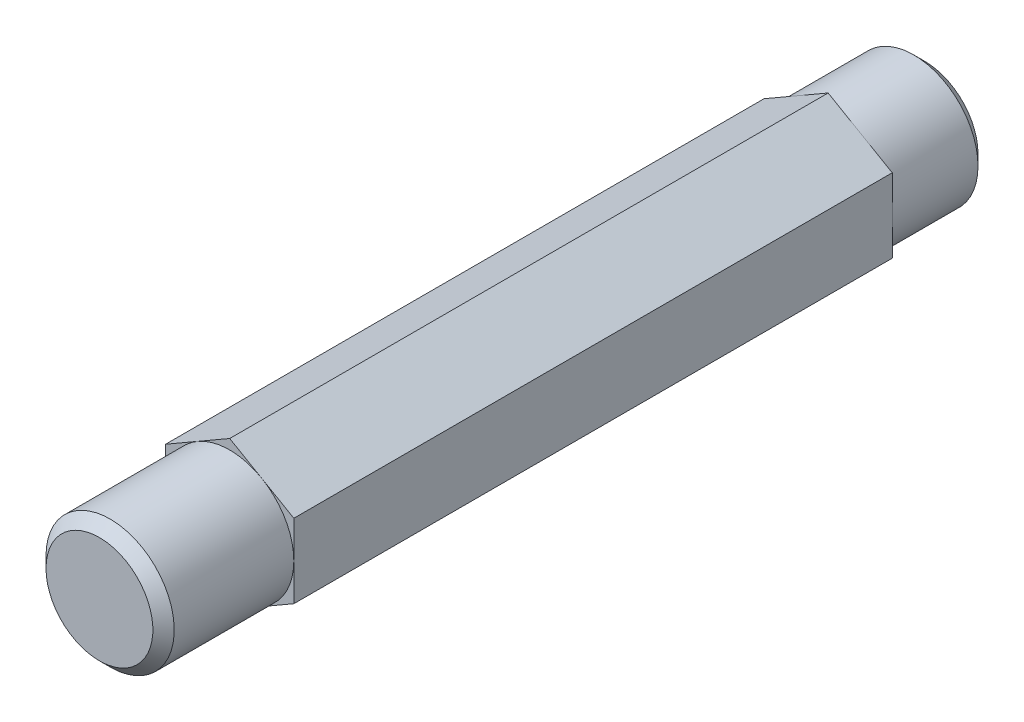
ISO-10303-21;
HEADER;
FILE_DESCRIPTION(('STEP AP214'),'2;1');
FILE_NAME('part.step','',(''),(''),'','','');
FILE_SCHEMA(('AUTOMOTIVE_DESIGN { 1 0 10303 214 1 1 1 1 }'));
ENDSEC;
DATA;
#1=APPLICATION_CONTEXT('core data for automotive mechanical design processes');
#2=APPLICATION_PROTOCOL_DEFINITION('international standard','automotive_design',2000,#1);
#3=PRODUCT_CONTEXT('',#1,'mechanical');
#4=PRODUCT('Part','Part','',(#3));
#5=PRODUCT_RELATED_PRODUCT_CATEGORY('part','',(#4));
#6=PRODUCT_DEFINITION_FORMATION('','',#4);
#7=PRODUCT_DEFINITION_CONTEXT('part definition',#1,'design');
#8=PRODUCT_DEFINITION('design','',#6,#7);
#9=PRODUCT_DEFINITION_SHAPE('','',#8);
#10=(LENGTH_UNIT() NAMED_UNIT(*) SI_UNIT(.MILLI.,.METRE.));
#11=(NAMED_UNIT(*) PLANE_ANGLE_UNIT() SI_UNIT($,.RADIAN.));
#12=(NAMED_UNIT(*) SI_UNIT($,.STERADIAN.) SOLID_ANGLE_UNIT());
#13=UNCERTAINTY_MEASURE_WITH_UNIT(LENGTH_MEASURE(1.E-05),#10,'distance_accuracy_value','');
#14=(GEOMETRIC_REPRESENTATION_CONTEXT(3) GLOBAL_UNCERTAINTY_ASSIGNED_CONTEXT((#13)) GLOBAL_UNIT_ASSIGNED_CONTEXT((#10,
#11,#12)) REPRESENTATION_CONTEXT('',''));
#15=CARTESIAN_POINT('',(0.,0.,0.));
#16=DIRECTION('',(0.,0.,1.));
#17=DIRECTION('',(1.,0.,0.));
#18=AXIS2_PLACEMENT_3D('',#15,#16,#17);
#19=CARTESIAN_POINT('',(13.6240384615385,8.79158869897365,44.45));
#20=DIRECTION('',(0.,0.,1.));
#21=DIRECTION('',(1.,0.,0.));
#22=AXIS2_PLACEMENT_3D('',#19,#20,#21);
#23=PLANE('',#22);
#24=CARTESIAN_POINT('',(8.86153846153845,6.04195804195804,44.45));
#25=DIRECTION('',(0.,0.,1.));
#26=DIRECTION('',(1.,0.,0.));
#27=AXIS2_PLACEMENT_3D('',#24,#25,#26);
#28=CIRCLE('',#27,4.76250000000001);
#29=CARTESIAN_POINT('',(13.6240384615385,6.04195804195804,44.45));
#30=VERTEX_POINT('',#29);
#31=CARTESIAN_POINT('',(11.2427884615385,10.1664040274814,44.45));
#32=VERTEX_POINT('',#31);
#33=EDGE_CURVE('E145',#30,#32,#28,.T.);
#34=ORIENTED_EDGE('',*,*,#33,.F.);
#35=DIRECTION('',(0.,1.,0.));
#36=VECTOR('',#35,1.);
#37=CARTESIAN_POINT('',(13.6240384615385,3.29232738494245,44.45));
#38=LINE('',#37,#36);
#39=CARTESIAN_POINT('',(13.6240384615385,8.79158869897365,44.45));
#40=VERTEX_POINT('',#39);
#41=EDGE_CURVE('E132',#30,#40,#38,.T.);
#42=ORIENTED_EDGE('',*,*,#41,.T.);
#43=DIRECTION('',(-0.866025403784439,0.5,0.));
#44=VECTOR('',#43,1.);
#45=CARTESIAN_POINT('',(13.6240384615385,8.79158869897365,44.45));
#46=LINE('',#45,#44);
#47=EDGE_CURVE('E146',#40,#32,#46,.T.);
#48=ORIENTED_EDGE('',*,*,#47,.T.);
#49=EDGE_LOOP('',(#34,#42,#48));
#50=FACE_BOUND('',#49,.T.);
#51=ADVANCED_FACE('F36',(#50),#23,.T.);
#52=CARTESIAN_POINT('',(6.48028846153845,10.1664040274814,44.45));
#53=VERTEX_POINT('',#52);
#54=EDGE_CURVE('E151',#32,#53,#28,.T.);
#55=ORIENTED_EDGE('',*,*,#54,.F.);
#56=CARTESIAN_POINT('',(8.86153846153846,11.5412193559892,44.45));
#57=VERTEX_POINT('',#56);
#58=EDGE_CURVE('E131',#32,#57,#46,.T.);
#59=ORIENTED_EDGE('',*,*,#58,.T.);
#60=DIRECTION('',(-0.866025403784439,-0.5,0.));
#61=VECTOR('',#60,1.);
#62=CARTESIAN_POINT('',(8.86153846153846,11.5412193559892,44.45));
#63=LINE('',#62,#61);
#64=EDGE_CURVE('E163',#57,#53,#63,.T.);
#65=ORIENTED_EDGE('',*,*,#64,.T.);
#66=EDGE_LOOP('',(#55,#59,#65));
#67=FACE_BOUND('',#66,.T.);
#68=ADVANCED_FACE('F232',(#67),#23,.T.);
#69=CARTESIAN_POINT('',(4.09903846153845,6.04195804195804,44.45));
#70=VERTEX_POINT('',#69);
#71=EDGE_CURVE('E270',#53,#70,#28,.T.);
#72=ORIENTED_EDGE('',*,*,#71,.F.);
#73=CARTESIAN_POINT('',(4.09903846153845,8.79158869897365,44.45));
#74=VERTEX_POINT('',#73);
#75=EDGE_CURVE('E162',#53,#74,#63,.T.);
#76=ORIENTED_EDGE('',*,*,#75,.T.);
#77=DIRECTION('',(0.,-1.,0.));
#78=VECTOR('',#77,1.);
#79=CARTESIAN_POINT('',(4.09903846153845,8.79158869897365,44.45));
#80=LINE('',#79,#78);
#81=EDGE_CURVE('E167',#74,#70,#80,.T.);
#82=ORIENTED_EDGE('',*,*,#81,.T.);
#83=EDGE_LOOP('',(#72,#76,#82));
#84=FACE_BOUND('',#83,.T.);
#85=ADVANCED_FACE('F237',(#84),#23,.T.);
#86=CARTESIAN_POINT('',(6.48028846153846,1.91751205643465,44.45));
#87=VERTEX_POINT('',#86);
#88=EDGE_CURVE('E155',#70,#87,#28,.T.);
#89=ORIENTED_EDGE('',*,*,#88,.F.);
#90=CARTESIAN_POINT('',(4.09903846153845,3.29232738494245,44.45));
#91=VERTEX_POINT('',#90);
#92=EDGE_CURVE('E166',#70,#91,#80,.T.);
#93=ORIENTED_EDGE('',*,*,#92,.T.);
#94=DIRECTION('',(0.866025403784439,-0.5,0.));
#95=VECTOR('',#94,1.);
#96=CARTESIAN_POINT('',(4.09903846153845,3.29232738494245,44.45));
#97=LINE('',#96,#95);
#98=EDGE_CURVE('E171',#91,#87,#97,.T.);
#99=ORIENTED_EDGE('',*,*,#98,.T.);
#100=EDGE_LOOP('',(#89,#93,#99));
#101=FACE_BOUND('',#100,.T.);
#102=ADVANCED_FACE('F254',(#101),#23,.T.);
#103=CARTESIAN_POINT('',(11.2427884615385,1.91751205643465,44.45));
#104=VERTEX_POINT('',#103);
#105=EDGE_CURVE('E59',#87,#104,#28,.T.);
#106=ORIENTED_EDGE('',*,*,#105,.F.);
#107=CARTESIAN_POINT('',(8.86153846153846,0.542696727926855,44.45));
#108=VERTEX_POINT('',#107);
#109=EDGE_CURVE('E170',#87,#108,#97,.T.);
#110=ORIENTED_EDGE('',*,*,#109,.T.);
#111=DIRECTION('',(0.866025403784439,0.5,0.));
#112=VECTOR('',#111,1.);
#113=CARTESIAN_POINT('',(8.86153846153846,0.542696727926855,44.45));
#114=LINE('',#113,#112);
#115=EDGE_CURVE('E174',#108,#104,#114,.T.);
#116=ORIENTED_EDGE('',*,*,#115,.T.);
#117=EDGE_LOOP('',(#106,#110,#116));
#118=FACE_BOUND('',#117,.T.);
#119=ADVANCED_FACE('F243',(#118),#23,.T.);
#120=CARTESIAN_POINT('',(8.86153846153846,6.04195804195805,-20.6331841816038));
#121=DIRECTION('',(0.,0.,1.));
#122=DIRECTION('',(1.,0.,0.));
#123=AXIS2_PLACEMENT_3D('',#120,#121,#122);
#124=CYLINDRICAL_SURFACE('',#123,4.76250000000001);
#125=CARTESIAN_POINT('',(8.86153846153846,6.04195804195805,-6.36905000000001));
#126=DIRECTION('',(0.,0.,1.));
#127=DIRECTION('',(1.,0.,0.));
#128=AXIS2_PLACEMENT_3D('',#125,#126,#127);
#129=CIRCLE('',#128,4.76250000000001);
#130=CARTESIAN_POINT('',(13.6240384615385,6.04195804195805,-6.36905000000001));
#131=VERTEX_POINT('',#130);
#132=EDGE_CURVE('E11',#131,#131,#129,.T.);
#133=ORIENTED_EDGE('',*,*,#132,.T.);
#134=EDGE_LOOP('',(#133));
#135=FACE_BOUND('',#134,.T.);
#136=CARTESIAN_POINT('',(8.86153846153846,6.04195804195805,0.));
#137=DIRECTION('',(0.,0.,1.));
#138=DIRECTION('',(1.,0.,0.));
#139=AXIS2_PLACEMENT_3D('',#136,#137,#138);
#140=CIRCLE('',#139,4.76250000000001);
#141=CARTESIAN_POINT('',(13.6240384615385,6.04195804195805,0.));
#142=VERTEX_POINT('',#141);
#143=CARTESIAN_POINT('',(11.2427884615385,10.1664040274814,0.));
#144=VERTEX_POINT('',#143);
#145=EDGE_CURVE('E154',#142,#144,#140,.T.);
#146=ORIENTED_EDGE('',*,*,#145,.F.);
#147=CARTESIAN_POINT('',(11.2427884615385,1.91751205643465,0.));
#148=VERTEX_POINT('',#147);
#149=EDGE_CURVE('E159',#148,#142,#140,.T.);
#150=ORIENTED_EDGE('',*,*,#149,.F.);
#151=CARTESIAN_POINT('',(6.48028846153846,1.91751205643465,0.));
#152=VERTEX_POINT('',#151);
#153=EDGE_CURVE('E311',#152,#148,#140,.T.);
#154=ORIENTED_EDGE('',*,*,#153,.F.);
#155=CARTESIAN_POINT('',(4.09903846153845,6.04195804195805,0.));
#156=VERTEX_POINT('',#155);
#157=EDGE_CURVE('E294',#156,#152,#140,.T.);
#158=ORIENTED_EDGE('',*,*,#157,.F.);
#159=CARTESIAN_POINT('',(6.48028846153846,10.1664040274814,0.));
#160=VERTEX_POINT('',#159);
#161=EDGE_CURVE('E290',#160,#156,#140,.T.);
#162=ORIENTED_EDGE('',*,*,#161,.F.);
#163=EDGE_CURVE('E157',#144,#160,#140,.T.);
#164=ORIENTED_EDGE('',*,*,#163,.F.);
#165=EDGE_LOOP('',(#146,#150,#154,#158,#162,#164));
#166=FACE_BOUND('',#165,.T.);
#167=ADVANCED_FACE('F253',(#135,#166),#124,.T.);
#168=CARTESIAN_POINT('',(8.86153846153846,6.04195804195805,-7.1628));
#169=DIRECTION('',(0.,0.,1.));
#170=DIRECTION('',(1.,0.,0.));
#171=AXIS2_PLACEMENT_3D('',#168,#169,#170);
#172=PLANE('',#171);
#173=CARTESIAN_POINT('',(8.86153846153846,6.04195804195805,-7.1628));
#174=DIRECTION('',(0.,0.,1.));
#175=DIRECTION('',(1.,0.,0.));
#176=AXIS2_PLACEMENT_3D('',#173,#174,#175);
#177=CIRCLE('',#176,3.96875000000003);
#178=CARTESIAN_POINT('',(12.8302884615385,6.04195804195805,-7.1628));
#179=VERTEX_POINT('',#178);
#180=EDGE_CURVE('E44',#179,#179,#177,.F.);
#181=ORIENTED_EDGE('',*,*,#180,.T.);
#182=EDGE_LOOP('',(#181));
#183=FACE_BOUND('',#182,.T.);
#184=ADVANCED_FACE('F220',(#183),#172,.F.);
#185=CARTESIAN_POINT('',(13.6240384615385,8.79158869897365,0.));
#186=DIRECTION('',(0.,0.,1.));
#187=DIRECTION('',(1.,0.,0.));
#188=AXIS2_PLACEMENT_3D('',#185,#186,#187);
#189=PLANE('',#188);
#190=DIRECTION('',(0.,1.,0.));
#191=VECTOR('',#190,1.);
#192=CARTESIAN_POINT('',(13.6240384615385,3.29232738494245,0.));
#193=LINE('',#192,#191);
#194=CARTESIAN_POINT('',(13.6240384615385,8.79158869897365,0.));
#195=VERTEX_POINT('',#194);
#196=EDGE_CURVE('E149',#142,#195,#193,.T.);
#197=ORIENTED_EDGE('',*,*,#196,.F.);
#198=ORIENTED_EDGE('',*,*,#145,.T.);
#199=DIRECTION('',(-0.866025403784439,0.5,0.));
#200=VECTOR('',#199,1.);
#201=CARTESIAN_POINT('',(13.6240384615385,8.79158869897365,0.));
#202=LINE('',#201,#200);
#203=EDGE_CURVE('E180',#195,#144,#202,.T.);
#204=ORIENTED_EDGE('',*,*,#203,.F.);
#205=EDGE_LOOP('',(#197,#198,#204));
#206=FACE_BOUND('',#205,.T.);
#207=ADVANCED_FACE('F314',(#206),#189,.F.);
#208=CARTESIAN_POINT('',(8.86153846153846,11.5412193559892,0.));
#209=VERTEX_POINT('',#208);
#210=EDGE_CURVE('E179',#144,#209,#202,.T.);
#211=ORIENTED_EDGE('',*,*,#210,.F.);
#212=ORIENTED_EDGE('',*,*,#163,.T.);
#213=DIRECTION('',(-0.866025403784439,-0.5,0.));
#214=VECTOR('',#213,1.);
#215=CARTESIAN_POINT('',(8.86153846153846,11.5412193559892,0.));
#216=LINE('',#215,#214);
#217=EDGE_CURVE('E184',#209,#160,#216,.T.);
#218=ORIENTED_EDGE('',*,*,#217,.F.);
#219=EDGE_LOOP('',(#211,#212,#218));
#220=FACE_BOUND('',#219,.T.);
#221=ADVANCED_FACE('F316',(#220),#189,.F.);
#222=CARTESIAN_POINT('',(4.09903846153845,8.79158869897365,0.));
#223=VERTEX_POINT('',#222);
#224=EDGE_CURVE('E183',#160,#223,#216,.T.);
#225=ORIENTED_EDGE('',*,*,#224,.F.);
#226=ORIENTED_EDGE('',*,*,#161,.T.);
#227=DIRECTION('',(0.,-1.,0.));
#228=VECTOR('',#227,1.);
#229=CARTESIAN_POINT('',(4.09903846153845,8.79158869897365,0.));
#230=LINE('',#229,#228);
#231=EDGE_CURVE('E188',#223,#156,#230,.T.);
#232=ORIENTED_EDGE('',*,*,#231,.F.);
#233=EDGE_LOOP('',(#225,#226,#232));
#234=FACE_BOUND('',#233,.T.);
#235=ADVANCED_FACE('F289',(#234),#189,.F.);
#236=CARTESIAN_POINT('',(4.09903846153845,3.29232738494245,0.));
#237=VERTEX_POINT('',#236);
#238=EDGE_CURVE('E187',#156,#237,#230,.T.);
#239=ORIENTED_EDGE('',*,*,#238,.F.);
#240=ORIENTED_EDGE('',*,*,#157,.T.);
#241=DIRECTION('',(0.866025403784439,-0.5,0.));
#242=VECTOR('',#241,1.);
#243=CARTESIAN_POINT('',(4.09903846153845,3.29232738494245,0.));
#244=LINE('',#243,#242);
#245=EDGE_CURVE('E192',#237,#152,#244,.T.);
#246=ORIENTED_EDGE('',*,*,#245,.F.);
#247=EDGE_LOOP('',(#239,#240,#246));
#248=FACE_BOUND('',#247,.T.);
#249=ADVANCED_FACE('F298',(#248),#189,.F.);
#250=CARTESIAN_POINT('',(8.86153846153846,0.542696727926855,0.));
#251=VERTEX_POINT('',#250);
#252=EDGE_CURVE('E191',#152,#251,#244,.T.);
#253=ORIENTED_EDGE('',*,*,#252,.F.);
#254=ORIENTED_EDGE('',*,*,#153,.T.);
#255=DIRECTION('',(0.866025403784439,0.5,0.));
#256=VECTOR('',#255,1.);
#257=CARTESIAN_POINT('',(8.86153846153846,0.542696727926855,0.));
#258=LINE('',#257,#256);
#259=EDGE_CURVE('E143',#251,#148,#258,.T.);
#260=ORIENTED_EDGE('',*,*,#259,.F.);
#261=EDGE_LOOP('',(#253,#254,#260));
#262=FACE_BOUND('',#261,.T.);
#263=ADVANCED_FACE('F362',(#262),#189,.F.);
#264=CARTESIAN_POINT('',(13.6240384615385,3.29232738494245,0.));
#265=VERTEX_POINT('',#264);
#266=EDGE_CURVE('E195',#148,#265,#258,.T.);
#267=ORIENTED_EDGE('',*,*,#266,.F.);
#268=ORIENTED_EDGE('',*,*,#149,.T.);
#269=EDGE_CURVE('E177',#265,#142,#193,.T.);
#270=ORIENTED_EDGE('',*,*,#269,.F.);
#271=EDGE_LOOP('',(#267,#268,#270));
#272=FACE_BOUND('',#271,.T.);
#273=ADVANCED_FACE('F308',(#272),#189,.F.);
#274=CARTESIAN_POINT('',(13.6240384615385,3.29232738494245,44.45));
#275=DIRECTION('',(-1.,0.,0.));
#276=DIRECTION('',(0.,-1.,0.));
#277=AXIS2_PLACEMENT_3D('',#274,#275,#276);
#278=PLANE('',#277);
#279=ORIENTED_EDGE('',*,*,#269,.T.);
#280=ORIENTED_EDGE('',*,*,#196,.T.);
#281=DIRECTION('',(0.,0.,-1.));
#282=VECTOR('',#281,1.);
#283=CARTESIAN_POINT('',(13.6240384615385,8.79158869897365,44.45));
#284=LINE('',#283,#282);
#285=EDGE_CURVE('E139',#40,#195,#284,.T.);
#286=ORIENTED_EDGE('',*,*,#285,.F.);
#287=ORIENTED_EDGE('',*,*,#41,.F.);
#288=CARTESIAN_POINT('',(13.6240384615385,3.29232738494245,44.45));
#289=VERTEX_POINT('',#288);
#290=EDGE_CURVE('E124',#289,#30,#38,.T.);
#291=ORIENTED_EDGE('',*,*,#290,.F.);
#292=DIRECTION('',(0.,0.,-1.));
#293=VECTOR('',#292,1.);
#294=CARTESIAN_POINT('',(13.6240384615385,3.29232738494245,44.45));
#295=LINE('',#294,#293);
#296=EDGE_CURVE('E176',#289,#265,#295,.T.);
#297=ORIENTED_EDGE('',*,*,#296,.T.);
#298=EDGE_LOOP('',(#279,#280,#286,#287,#291,#297));
#299=FACE_BOUND('',#298,.T.);
#300=ADVANCED_FACE('F137',(#299),#278,.F.);
#301=CARTESIAN_POINT('',(13.6240384615385,8.79158869897365,44.45));
#302=DIRECTION('',(-0.5,-0.866025403784439,0.));
#303=DIRECTION('',(0.866025403784439,-0.5,0.));
#304=AXIS2_PLACEMENT_3D('',#301,#302,#303);
#305=PLANE('',#304);
#306=ORIENTED_EDGE('',*,*,#203,.T.);
#307=ORIENTED_EDGE('',*,*,#210,.T.);
#308=DIRECTION('',(0.,0.,-1.));
#309=VECTOR('',#308,1.);
#310=CARTESIAN_POINT('',(8.86153846153846,11.5412193559892,44.45));
#311=LINE('',#310,#309);
#312=EDGE_CURVE('E208',#57,#209,#311,.T.);
#313=ORIENTED_EDGE('',*,*,#312,.F.);
#314=ORIENTED_EDGE('',*,*,#58,.F.);
#315=ORIENTED_EDGE('',*,*,#47,.F.);
#316=ORIENTED_EDGE('',*,*,#285,.T.);
#317=EDGE_LOOP('',(#306,#307,#313,#314,#315,#316));
#318=FACE_BOUND('',#317,.T.);
#319=ADVANCED_FACE('F280',(#318),#305,.F.);
#320=CARTESIAN_POINT('',(8.86153846153846,11.5412193559892,44.45));
#321=DIRECTION('',(0.5,-0.866025403784439,0.));
#322=DIRECTION('',(0.866025403784439,0.5,0.));
#323=AXIS2_PLACEMENT_3D('',#320,#321,#322);
#324=PLANE('',#323);
#325=ORIENTED_EDGE('',*,*,#217,.T.);
#326=ORIENTED_EDGE('',*,*,#224,.T.);
#327=DIRECTION('',(0.,0.,-1.));
#328=VECTOR('',#327,1.);
#329=CARTESIAN_POINT('',(4.09903846153845,8.79158869897365,44.45));
#330=LINE('',#329,#328);
#331=EDGE_CURVE('E205',#74,#223,#330,.T.);
#332=ORIENTED_EDGE('',*,*,#331,.F.);
#333=ORIENTED_EDGE('',*,*,#75,.F.);
#334=ORIENTED_EDGE('',*,*,#64,.F.);
#335=ORIENTED_EDGE('',*,*,#312,.T.);
#336=EDGE_LOOP('',(#325,#326,#332,#333,#334,#335));
#337=FACE_BOUND('',#336,.T.);
#338=ADVANCED_FACE('F284',(#337),#324,.F.);
#339=CARTESIAN_POINT('',(4.09903846153845,8.79158869897365,44.45));
#340=DIRECTION('',(1.,0.,0.));
#341=DIRECTION('',(0.,1.,0.));
#342=AXIS2_PLACEMENT_3D('',#339,#340,#341);
#343=PLANE('',#342);
#344=ORIENTED_EDGE('',*,*,#231,.T.);
#345=ORIENTED_EDGE('',*,*,#238,.T.);
#346=DIRECTION('',(0.,0.,-1.));
#347=VECTOR('',#346,1.);
#348=CARTESIAN_POINT('',(4.09903846153845,3.29232738494245,44.45));
#349=LINE('',#348,#347);
#350=EDGE_CURVE('E202',#91,#237,#349,.T.);
#351=ORIENTED_EDGE('',*,*,#350,.F.);
#352=ORIENTED_EDGE('',*,*,#92,.F.);
#353=ORIENTED_EDGE('',*,*,#81,.F.);
#354=ORIENTED_EDGE('',*,*,#331,.T.);
#355=EDGE_LOOP('',(#344,#345,#351,#352,#353,#354));
#356=FACE_BOUND('',#355,.T.);
#357=ADVANCED_FACE('F273',(#356),#343,.F.);
#358=CARTESIAN_POINT('',(4.09903846153845,3.29232738494245,44.45));
#359=DIRECTION('',(0.5,0.866025403784439,0.));
#360=DIRECTION('',(-0.866025403784439,0.5,0.));
#361=AXIS2_PLACEMENT_3D('',#358,#359,#360);
#362=PLANE('',#361);
#363=ORIENTED_EDGE('',*,*,#245,.T.);
#364=ORIENTED_EDGE('',*,*,#252,.T.);
#365=DIRECTION('',(0.,0.,-1.));
#366=VECTOR('',#365,1.);
#367=CARTESIAN_POINT('',(8.86153846153846,0.542696727926855,44.45));
#368=LINE('',#367,#366);
#369=EDGE_CURVE('E199',#108,#251,#368,.T.);
#370=ORIENTED_EDGE('',*,*,#369,.F.);
#371=ORIENTED_EDGE('',*,*,#109,.F.);
#372=ORIENTED_EDGE('',*,*,#98,.F.);
#373=ORIENTED_EDGE('',*,*,#350,.T.);
#374=EDGE_LOOP('',(#363,#364,#370,#371,#372,#373));
#375=FACE_BOUND('',#374,.T.);
#376=ADVANCED_FACE('F249',(#375),#362,.F.);
#377=CARTESIAN_POINT('',(8.86153846153846,0.542696727926855,44.45));
#378=DIRECTION('',(-0.5,0.866025403784439,0.));
#379=DIRECTION('',(-0.866025403784439,-0.5,0.));
#380=AXIS2_PLACEMENT_3D('',#377,#378,#379);
#381=PLANE('',#380);
#382=ORIENTED_EDGE('',*,*,#259,.T.);
#383=ORIENTED_EDGE('',*,*,#266,.T.);
#384=ORIENTED_EDGE('',*,*,#296,.F.);
#385=EDGE_CURVE('E127',#104,#289,#114,.T.);
#386=ORIENTED_EDGE('',*,*,#385,.F.);
#387=ORIENTED_EDGE('',*,*,#115,.F.);
#388=ORIENTED_EDGE('',*,*,#369,.T.);
#389=EDGE_LOOP('',(#382,#383,#384,#386,#387,#388));
#390=FACE_BOUND('',#389,.T.);
#391=ADVANCED_FACE('F242',(#390),#381,.F.);
#392=EDGE_CURVE('E51',#104,#30,#28,.T.);
#393=ORIENTED_EDGE('',*,*,#392,.F.);
#394=ORIENTED_EDGE('',*,*,#385,.T.);
#395=ORIENTED_EDGE('',*,*,#290,.T.);
#396=EDGE_LOOP('',(#393,#394,#395));
#397=FACE_BOUND('',#396,.T.);
#398=ADVANCED_FACE('F126',(#397),#23,.T.);
#399=CARTESIAN_POINT('',(8.86153846153845,6.04195804195804,67.5977841816038));
#400=DIRECTION('',(0.,0.,-1.));
#401=DIRECTION('',(-1.,0.,0.));
#402=AXIS2_PLACEMENT_3D('',#399,#400,#401);
#403=CYLINDRICAL_SURFACE('',#402,4.76250000000001);
#404=CARTESIAN_POINT('',(8.86153846153845,6.04195804195804,53.33365));
#405=DIRECTION('',(0.,0.,-1.));
#406=DIRECTION('',(-1.,0.,0.));
#407=AXIS2_PLACEMENT_3D('',#404,#405,#406);
#408=CIRCLE('',#407,4.76250000000001);
#409=CARTESIAN_POINT('',(4.09903846153845,6.04195804195804,53.33365));
#410=VERTEX_POINT('',#409);
#411=EDGE_CURVE('E212',#410,#410,#408,.T.);
#412=ORIENTED_EDGE('',*,*,#411,.T.);
#413=EDGE_LOOP('',(#412));
#414=FACE_BOUND('',#413,.T.);
#415=ORIENTED_EDGE('',*,*,#33,.T.);
#416=ORIENTED_EDGE('',*,*,#54,.T.);
#417=ORIENTED_EDGE('',*,*,#71,.T.);
#418=ORIENTED_EDGE('',*,*,#88,.T.);
#419=ORIENTED_EDGE('',*,*,#105,.T.);
#420=ORIENTED_EDGE('',*,*,#392,.T.);
#421=EDGE_LOOP('',(#415,#416,#417,#418,#419,#420));
#422=FACE_BOUND('',#421,.T.);
#423=ADVANCED_FACE('F152',(#414,#422),#403,.T.);
#424=CARTESIAN_POINT('',(8.86153846153853,6.04195804195816,54.1274));
#425=DIRECTION('',(0.,0.,-1.));
#426=DIRECTION('',(-0.835351877492613,0.549715599896498,0.));
#427=AXIS2_PLACEMENT_3D('',#424,#425,#426);
#428=PLANE('',#427);
#429=CARTESIAN_POINT('',(8.86153846153845,6.04195804195804,54.1274));
#430=DIRECTION('',(0.,0.,-1.));
#431=DIRECTION('',(0.,1.,0.));
#432=AXIS2_PLACEMENT_3D('',#429,#430,#431);
#433=CIRCLE('',#432,3.96875000000001);
#434=CARTESIAN_POINT('',(4.89278846153845,6.04195804195804,54.1274));
#435=VERTEX_POINT('',#434);
#436=EDGE_CURVE('E215',#435,#435,#433,.F.);
#437=ORIENTED_EDGE('',*,*,#436,.T.);
#438=EDGE_LOOP('',(#437));
#439=FACE_BOUND('',#438,.T.);
#440=ADVANCED_FACE('F228',(#439),#428,.F.);
#441=CARTESIAN_POINT('',(8.86153846153845,6.04195804195804,53.33365));
#442=DIRECTION('',(0.,0.,-1.));
#443=DIRECTION('',(-1.,0.,0.));
#444=AXIS2_PLACEMENT_3D('',#441,#442,#443);
#445=CONICAL_SURFACE('',#444,4.76250000000001,0.785398163397447);
#446=CARTESIAN_POINT('',(4.89278846153845,6.04195804195804,54.1274));
#447=CARTESIAN_POINT('',(4.88452023237178,6.04195804195804,54.1191317708333));
#448=CARTESIAN_POINT('',(4.87625200320511,6.04195804195804,54.1108635416667));
#449=CARTESIAN_POINT('',(4.85971554487178,6.04195804195804,54.0943270833333));
#450=CARTESIAN_POINT('',(4.85144731570511,6.04195804195804,54.0860588541667));
#451=CARTESIAN_POINT('',(4.83491085737178,6.04195804195804,54.0695223958333));
#452=CARTESIAN_POINT('',(4.82664262820511,6.04195804195804,54.0612541666667));
#453=CARTESIAN_POINT('',(4.81010616987178,6.04195804195804,54.0447177083333));
#454=CARTESIAN_POINT('',(4.80183794070511,6.04195804195804,54.0364494791667));
#455=CARTESIAN_POINT('',(4.78530148237178,6.04195804195804,54.0199130208333));
#456=CARTESIAN_POINT('',(4.77703325320511,6.04195804195804,54.0116447916667));
#457=CARTESIAN_POINT('',(4.76049679487178,6.04195804195804,53.9951083333333));
#458=CARTESIAN_POINT('',(4.75222856570511,6.04195804195804,53.9868401041667));
#459=CARTESIAN_POINT('',(4.73569210737178,6.04195804195804,53.9703036458333));
#460=CARTESIAN_POINT('',(4.72742387820511,6.04195804195804,53.9620354166667));
#461=CARTESIAN_POINT('',(4.71088741987178,6.04195804195804,53.9454989583333));
#462=CARTESIAN_POINT('',(4.70261919070511,6.04195804195804,53.9372307291667));
#463=CARTESIAN_POINT('',(4.68608273237178,6.04195804195804,53.9206942708333));
#464=CARTESIAN_POINT('',(4.67781450320511,6.04195804195804,53.9124260416667));
#465=CARTESIAN_POINT('',(4.66127804487178,6.04195804195804,53.8958895833333));
#466=CARTESIAN_POINT('',(4.65300981570511,6.04195804195804,53.8876213541667));
#467=CARTESIAN_POINT('',(4.63647335737178,6.04195804195804,53.8710848958333));
#468=CARTESIAN_POINT('',(4.62820512820511,6.04195804195804,53.8628166666667));
#469=CARTESIAN_POINT('',(4.61166866987178,6.04195804195804,53.8462802083333));
#470=CARTESIAN_POINT('',(4.60340044070511,6.04195804195804,53.8380119791667));
#471=CARTESIAN_POINT('',(4.58686398237178,6.04195804195804,53.8214755208333));
#472=CARTESIAN_POINT('',(4.57859575320511,6.04195804195804,53.8132072916667));
#473=CARTESIAN_POINT('',(4.56205929487178,6.04195804195804,53.7966708333333));
#474=CARTESIAN_POINT('',(4.55379106570511,6.04195804195804,53.7884026041667));
#475=CARTESIAN_POINT('',(4.53725460737178,6.04195804195804,53.7718661458334));
#476=CARTESIAN_POINT('',(4.52898637820511,6.04195804195804,53.7635979166667));
#477=CARTESIAN_POINT('',(4.51244991987178,6.04195804195804,53.7470614583333));
#478=CARTESIAN_POINT('',(4.50418169070511,6.04195804195804,53.7387932291667));
#479=CARTESIAN_POINT('',(4.48764523237178,6.04195804195804,53.7222567708333));
#480=CARTESIAN_POINT('',(4.47937700320512,6.04195804195804,53.7139885416667));
#481=CARTESIAN_POINT('',(4.46284054487178,6.04195804195804,53.6974520833333));
#482=CARTESIAN_POINT('',(4.45457231570512,6.04195804195804,53.6891838541667));
#483=CARTESIAN_POINT('',(4.43803585737178,6.04195804195804,53.6726473958334));
#484=CARTESIAN_POINT('',(4.42976762820511,6.04195804195804,53.6643791666667));
#485=CARTESIAN_POINT('',(4.41323116987178,6.04195804195804,53.6478427083333));
#486=CARTESIAN_POINT('',(4.40496294070512,6.04195804195804,53.6395744791667));
#487=CARTESIAN_POINT('',(4.38842648237178,6.04195804195804,53.6230380208333));
#488=CARTESIAN_POINT('',(4.38015825320512,6.04195804195804,53.6147697916667));
#489=CARTESIAN_POINT('',(4.36362179487178,6.04195804195804,53.5982333333333));
#490=CARTESIAN_POINT('',(4.35535356570511,6.04195804195804,53.5899651041667));
#491=CARTESIAN_POINT('',(4.33881710737178,6.04195804195804,53.5734286458333));
#492=CARTESIAN_POINT('',(4.33054887820512,6.04195804195804,53.5651604166667));
#493=CARTESIAN_POINT('',(4.31401241987178,6.04195804195804,53.5486239583333));
#494=CARTESIAN_POINT('',(4.30574419070512,6.04195804195804,53.5403557291667));
#495=CARTESIAN_POINT('',(4.28920773237178,6.04195804195804,53.5238192708334));
#496=CARTESIAN_POINT('',(4.28093950320512,6.04195804195804,53.5155510416667));
#497=CARTESIAN_POINT('',(4.26440304487178,6.04195804195804,53.4990145833333));
#498=CARTESIAN_POINT('',(4.25613481570512,6.04195804195804,53.4907463541667));
#499=CARTESIAN_POINT('',(4.23959835737178,6.04195804195804,53.4742098958333));
#500=CARTESIAN_POINT('',(4.23133012820512,6.04195804195804,53.4659416666667));
#501=CARTESIAN_POINT('',(4.21479366987178,6.04195804195804,53.4494052083333));
#502=CARTESIAN_POINT('',(4.20652544070512,6.04195804195804,53.4411369791667));
#503=CARTESIAN_POINT('',(4.18998898237178,6.04195804195804,53.4246005208333));
#504=CARTESIAN_POINT('',(4.18172075320512,6.04195804195804,53.4163322916667));
#505=CARTESIAN_POINT('',(4.16518429487178,6.04195804195804,53.3997958333334));
#506=CARTESIAN_POINT('',(4.15691606570512,6.04195804195804,53.3915276041667));
#507=CARTESIAN_POINT('',(4.14037960737178,6.04195804195804,53.3749911458333));
#508=CARTESIAN_POINT('',(4.13211137820512,6.04195804195804,53.3667229166667));
#509=CARTESIAN_POINT('',(4.11557491987178,6.04195804195804,53.3501864583333));
#510=CARTESIAN_POINT('',(4.10730669070512,6.04195804195804,53.3419182291667));
#511=CARTESIAN_POINT('',(4.09903846153845,6.04195804195804,53.33365));
#512=B_SPLINE_CURVE_WITH_KNOTS('',3,(#446,#447,#448,#449,#450,#451,#452,#453,#454,#455,#456,
#457,#458,#459,#460,#461,#462,#463,#464,#465,#466,#467,#468,#469,#470,#471,#472,#473,#474,#475,
#476,#477,#478,#479,#480,#481,#482,#483,#484,#485,#486,#487,#488,#489,#490,#491,#492,#493,#494,
#495,#496,#497,#498,#499,#500,#501,#502,#503,#504,#505,#506,#507,#508,#509,#510,#511),
.UNSPECIFIED.,.F.,.F.,(4,2,2,2,2,2,2,2,2,2,2,2,2,2,2,2,2,2,2,2,2,2,2,2,2,2,2,2,2,2,2,2,4),(0.,
0.0350791254729293,0.0701582509458542,0.105237376418779,0.140316501891708,0.175395627364633,
0.210474752837557,0.245553878310487,0.280633003783411,0.315712129256336,0.350791254729266,
0.385870380202191,0.420949505675115,0.456028631148045,0.491107756620969,0.526186882093894,
0.561266007566819,0.596345133039748,0.631424258512673,0.666503383985597,0.701582509458527,
0.736661634931452,0.771740760404376,0.806819885877306,0.84189901135023,0.876978136823155,
0.912057262296084,0.947136387769009,0.982215513241934,1.01729463871486,1.05237376418779,
1.08745288966071,1.12253201513364),.UNSPECIFIED.);
#513=EDGE_CURVE('BSEAM223',#435,#410,#512,.T.);
#514=ORIENTED_EDGE('',*,*,#436,.F.);
#515=ORIENTED_EDGE('',*,*,#411,.F.);
#516=ORIENTED_EDGE('',*,*,#513,.T.);
#517=ORIENTED_EDGE('',*,*,#513,.F.);
#518=EDGE_LOOP('',(#514,#516,#515,#517));
#519=FACE_BOUND('',#518,.T.);
#520=ADVANCED_FACE('F223',(#519),#445,.T.);
#521=CARTESIAN_POINT('',(8.86153846153846,6.04195804195805,-7.1628));
#522=DIRECTION('',(0.,0.,1.));
#523=DIRECTION('',(1.,0.,0.));
#524=AXIS2_PLACEMENT_3D('',#521,#522,#523);
#525=CONICAL_SURFACE('',#524,3.96875000000003,0.785398163397448);
#526=ORIENTED_EDGE('',*,*,#132,.F.);
#527=EDGE_LOOP('',(#526));
#528=FACE_BOUND('',#527,.T.);
#529=ORIENTED_EDGE('',*,*,#180,.F.);
#530=EDGE_LOOP('',(#529));
#531=FACE_BOUND('',#530,.T.);
#532=ADVANCED_FACE('F38',(#528,#531),#525,.T.);
#533=CLOSED_SHELL('',(#51,#68,#85,#102,#119,#167,#184,#207,#221,#235,#249,#263,#273,#300,#319,
#338,#357,#376,#391,#398,#423,#440,#520,#532));
#534=MANIFOLD_SOLID_BREP('B2',#533);
#535=ADVANCED_BREP_SHAPE_REPRESENTATION('',(#18,#534),#14);
#536=SHAPE_DEFINITION_REPRESENTATION(#9,#535);
ENDSEC;
END-ISO-10303-21;
